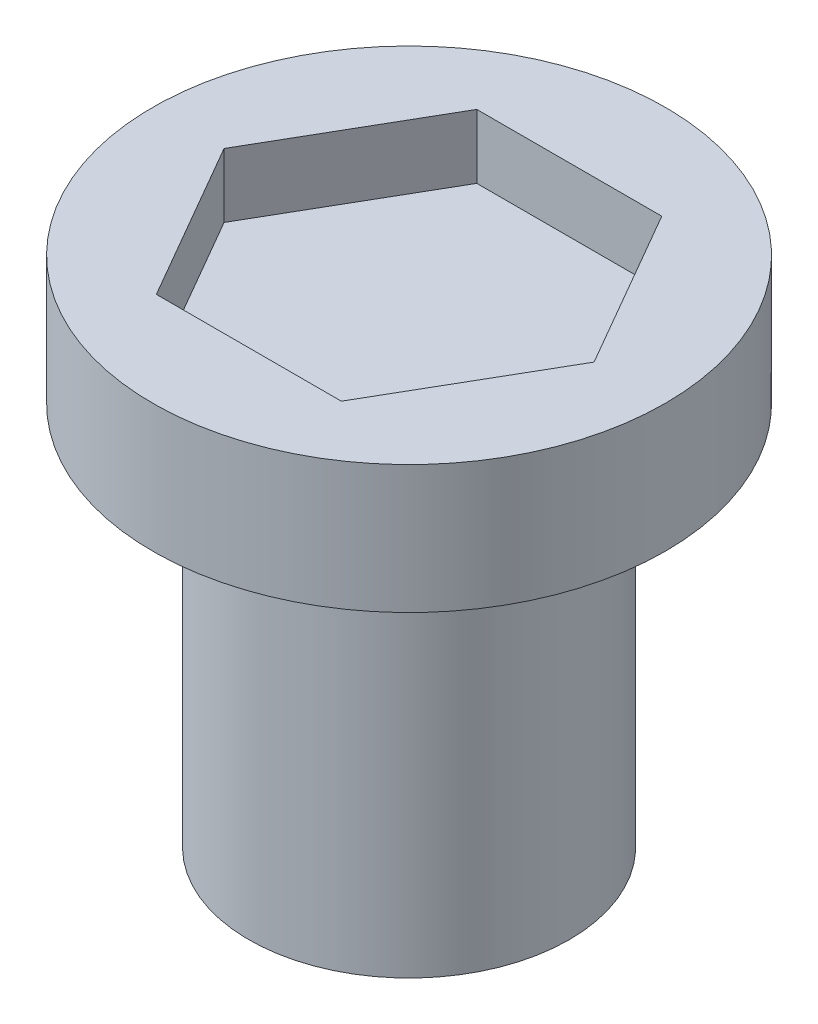
ISO-10303-21;
HEADER;
FILE_DESCRIPTION(('STEP AP214'),'2;1');
FILE_NAME('part.step','',(''),(''),'','','');
FILE_SCHEMA(('AUTOMOTIVE_DESIGN { 1 0 10303 214 1 1 1 1 }'));
ENDSEC;
DATA;
#1=APPLICATION_CONTEXT('core data for automotive mechanical design processes');
#2=APPLICATION_PROTOCOL_DEFINITION('international standard','automotive_design',2000,#1);
#3=PRODUCT_CONTEXT('',#1,'mechanical');
#4=PRODUCT('Part','Part','',(#3));
#5=PRODUCT_RELATED_PRODUCT_CATEGORY('part','',(#4));
#6=PRODUCT_DEFINITION_FORMATION('','',#4);
#7=PRODUCT_DEFINITION_CONTEXT('part definition',#1,'design');
#8=PRODUCT_DEFINITION('design','',#6,#7);
#9=PRODUCT_DEFINITION_SHAPE('','',#8);
#10=(LENGTH_UNIT() NAMED_UNIT(*) SI_UNIT(.MILLI.,.METRE.));
#11=(NAMED_UNIT(*) PLANE_ANGLE_UNIT() SI_UNIT($,.RADIAN.));
#12=(NAMED_UNIT(*) SI_UNIT($,.STERADIAN.) SOLID_ANGLE_UNIT());
#13=UNCERTAINTY_MEASURE_WITH_UNIT(LENGTH_MEASURE(1.E-05),#10,'distance_accuracy_value','');
#14=(GEOMETRIC_REPRESENTATION_CONTEXT(3) GLOBAL_UNCERTAINTY_ASSIGNED_CONTEXT((#13)) GLOBAL_UNIT_ASSIGNED_CONTEXT((#10,
#11,#12)) REPRESENTATION_CONTEXT('',''));
#15=CARTESIAN_POINT('',(0.,0.,0.));
#16=DIRECTION('',(0.,0.,1.));
#17=DIRECTION('',(1.,0.,0.));
#18=AXIS2_PLACEMENT_3D('',#15,#16,#17);
#19=CARTESIAN_POINT('',(0.,0.,0.));
#20=DIRECTION('',(0.,-1.,0.));
#21=DIRECTION('',(1.,0.,0.));
#22=AXIS2_PLACEMENT_3D('',#19,#20,#21);
#23=PLANE('',#22);
#24=CARTESIAN_POINT('',(0.,0.,0.));
#25=DIRECTION('',(0.,-1.,0.));
#26=DIRECTION('',(1.,0.,0.));
#27=AXIS2_PLACEMENT_3D('',#24,#25,#26);
#28=CIRCLE('',#27,1.25);
#29=CARTESIAN_POINT('',(1.25,0.,0.));
#30=VERTEX_POINT('',#29);
#31=EDGE_CURVE('E11',#30,#30,#28,.T.);
#32=ORIENTED_EDGE('',*,*,#31,.T.);
#33=EDGE_LOOP('',(#32));
#34=FACE_BOUND('',#33,.T.);
#35=ADVANCED_FACE('F43',(#34),#23,.T.);
#36=CARTESIAN_POINT('',(0.,4.,0.));
#37=DIRECTION('',(0.,-1.,0.));
#38=DIRECTION('',(1.,0.,0.));
#39=AXIS2_PLACEMENT_3D('',#36,#37,#38);
#40=CYLINDRICAL_SURFACE('',#39,1.25);
#41=CARTESIAN_POINT('',(0.,3.,0.));
#42=DIRECTION('',(0.,-1.,0.));
#43=DIRECTION('',(1.,0.,0.));
#44=AXIS2_PLACEMENT_3D('',#41,#42,#43);
#45=CIRCLE('',#44,1.25);
#46=CARTESIAN_POINT('',(1.25,3.,0.));
#47=VERTEX_POINT('',#46);
#48=EDGE_CURVE('E51',#47,#47,#45,.T.);
#49=ORIENTED_EDGE('',*,*,#48,.T.);
#50=EDGE_LOOP('',(#49));
#51=FACE_BOUND('',#50,.T.);
#52=ORIENTED_EDGE('',*,*,#31,.F.);
#53=EDGE_LOOP('',(#52));
#54=FACE_BOUND('',#53,.T.);
#55=ADVANCED_FACE('F177',(#51,#54),#40,.T.);
#56=CARTESIAN_POINT('',(1.25,3.,0.));
#57=DIRECTION('',(0.,-1.,0.));
#58=DIRECTION('',(1.,0.,0.));
#59=AXIS2_PLACEMENT_3D('',#56,#57,#58);
#60=PLANE('',#59);
#61=CARTESIAN_POINT('',(0.,3.,0.));
#62=DIRECTION('',(0.,-1.,0.));
#63=DIRECTION('',(1.,0.,0.));
#64=AXIS2_PLACEMENT_3D('',#61,#62,#63);
#65=CIRCLE('',#64,2.);
#66=CARTESIAN_POINT('',(2.,3.,0.));
#67=VERTEX_POINT('',#66);
#68=EDGE_CURVE('E170',#67,#67,#65,.T.);
#69=ORIENTED_EDGE('',*,*,#68,.T.);
#70=EDGE_LOOP('',(#69));
#71=FACE_BOUND('',#70,.T.);
#72=ORIENTED_EDGE('',*,*,#48,.F.);
#73=EDGE_LOOP('',(#72));
#74=FACE_BOUND('',#73,.T.);
#75=ADVANCED_FACE('F180',(#71,#74),#60,.T.);
#76=CARTESIAN_POINT('',(0.,4.,0.));
#77=DIRECTION('',(0.,-1.,0.));
#78=DIRECTION('',(1.,0.,0.));
#79=AXIS2_PLACEMENT_3D('',#76,#77,#78);
#80=CYLINDRICAL_SURFACE('',#79,2.);
#81=CARTESIAN_POINT('',(0.,4.,0.));
#82=DIRECTION('',(0.,-1.,0.));
#83=DIRECTION('',(1.,0.,0.));
#84=AXIS2_PLACEMENT_3D('',#81,#82,#83);
#85=CIRCLE('',#84,2.);
#86=CARTESIAN_POINT('',(2.,4.,0.));
#87=VERTEX_POINT('',#86);
#88=EDGE_CURVE('E157',#87,#87,#85,.T.);
#89=ORIENTED_EDGE('',*,*,#88,.T.);
#90=EDGE_LOOP('',(#89));
#91=FACE_BOUND('',#90,.T.);
#92=ORIENTED_EDGE('',*,*,#68,.F.);
#93=EDGE_LOOP('',(#92));
#94=FACE_BOUND('',#93,.T.);
#95=ADVANCED_FACE('F182',(#91,#94),#80,.T.);
#96=CARTESIAN_POINT('',(2.,4.,0.));
#97=DIRECTION('',(0.,1.,0.));
#98=DIRECTION('',(-1.,0.,0.));
#99=AXIS2_PLACEMENT_3D('',#96,#97,#98);
#100=PLANE('',#99);
#101=DIRECTION('',(0.5,0.,-0.866025403784439));
#102=VECTOR('',#101,1.);
#103=CARTESIAN_POINT('',(0.721687836487032,4.,1.25));
#104=LINE('',#103,#102);
#105=CARTESIAN_POINT('',(0.721687836487032,4.,1.25));
#106=VERTEX_POINT('',#105);
#107=CARTESIAN_POINT('',(1.44337567297406,4.,0.));
#108=VERTEX_POINT('',#107);
#109=EDGE_CURVE('E58',#106,#108,#104,.T.);
#110=ORIENTED_EDGE('',*,*,#109,.F.);
#111=DIRECTION('',(1.,0.,0.));
#112=VECTOR('',#111,1.);
#113=CARTESIAN_POINT('',(-0.721687836487033,4.,1.25));
#114=LINE('',#113,#112);
#115=CARTESIAN_POINT('',(-0.721687836487033,4.,1.25));
#116=VERTEX_POINT('',#115);
#117=EDGE_CURVE('E151',#116,#106,#114,.T.);
#118=ORIENTED_EDGE('',*,*,#117,.F.);
#119=DIRECTION('',(0.5,0.,0.866025403784438));
#120=VECTOR('',#119,1.);
#121=CARTESIAN_POINT('',(-1.44337567297407,4.,0.));
#122=LINE('',#121,#120);
#123=CARTESIAN_POINT('',(-1.44337567297407,4.,0.));
#124=VERTEX_POINT('',#123);
#125=EDGE_CURVE('E148',#124,#116,#122,.T.);
#126=ORIENTED_EDGE('',*,*,#125,.F.);
#127=DIRECTION('',(-0.5,0.,0.866025403784439));
#128=VECTOR('',#127,1.);
#129=CARTESIAN_POINT('',(-0.721687836487033,4.,-1.25));
#130=LINE('',#129,#128);
#131=CARTESIAN_POINT('',(-0.721687836487033,4.,-1.25));
#132=VERTEX_POINT('',#131);
#133=EDGE_CURVE('E106',#132,#124,#130,.T.);
#134=ORIENTED_EDGE('',*,*,#133,.F.);
#135=DIRECTION('',(-1.,0.,0.));
#136=VECTOR('',#135,1.);
#137=CARTESIAN_POINT('',(0.721687836487031,4.,-1.25));
#138=LINE('',#137,#136);
#139=CARTESIAN_POINT('',(0.721687836487031,4.,-1.25));
#140=VERTEX_POINT('',#139);
#141=EDGE_CURVE('E142',#140,#132,#138,.T.);
#142=ORIENTED_EDGE('',*,*,#141,.F.);
#143=DIRECTION('',(-0.5,0.,-0.866025403784438));
#144=VECTOR('',#143,1.);
#145=CARTESIAN_POINT('',(1.44337567297406,4.,0.));
#146=LINE('',#145,#144);
#147=EDGE_CURVE('E138',#108,#140,#146,.T.);
#148=ORIENTED_EDGE('',*,*,#147,.F.);
#149=EDGE_LOOP('',(#110,#118,#126,#134,#142,#148));
#150=FACE_BOUND('',#149,.T.);
#151=ORIENTED_EDGE('',*,*,#88,.F.);
#152=EDGE_LOOP('',(#151));
#153=FACE_BOUND('',#152,.T.);
#154=ADVANCED_FACE('F189',(#150,#153),#100,.T.);
#155=CARTESIAN_POINT('',(0.721687836487032,3.5,1.25));
#156=DIRECTION('',(0.866025403784439,0.,0.5));
#157=DIRECTION('',(0.5,0.,-0.866025403784439));
#158=AXIS2_PLACEMENT_3D('',#155,#156,#157);
#159=PLANE('',#158);
#160=ORIENTED_EDGE('',*,*,#109,.T.);
#161=DIRECTION('',(0.,1.,0.));
#162=VECTOR('',#161,1.);
#163=CARTESIAN_POINT('',(1.44337567297406,3.5,0.));
#164=LINE('',#163,#162);
#165=CARTESIAN_POINT('',(1.44337567297406,3.5,0.));
#166=VERTEX_POINT('',#165);
#167=EDGE_CURVE('E88',#166,#108,#164,.T.);
#168=ORIENTED_EDGE('',*,*,#167,.F.);
#169=DIRECTION('',(0.5,0.,-0.866025403784439));
#170=VECTOR('',#169,1.);
#171=CARTESIAN_POINT('',(0.721687836487032,3.5,1.25));
#172=LINE('',#171,#170);
#173=CARTESIAN_POINT('',(0.721687836487032,3.5,1.25));
#174=VERTEX_POINT('',#173);
#175=EDGE_CURVE('E154',#174,#166,#172,.T.);
#176=ORIENTED_EDGE('',*,*,#175,.F.);
#177=DIRECTION('',(0.,1.,0.));
#178=VECTOR('',#177,1.);
#179=CARTESIAN_POINT('',(0.721687836487032,3.5,1.25));
#180=LINE('',#179,#178);
#181=EDGE_CURVE('E66',#174,#106,#180,.T.);
#182=ORIENTED_EDGE('',*,*,#181,.T.);
#183=EDGE_LOOP('',(#160,#168,#176,#182));
#184=FACE_BOUND('',#183,.T.);
#185=ADVANCED_FACE('F223',(#184),#159,.F.);
#186=CARTESIAN_POINT('',(-0.721687836487033,3.5,1.25));
#187=DIRECTION('',(0.,0.,1.));
#188=DIRECTION('',(1.,0.,0.));
#189=AXIS2_PLACEMENT_3D('',#186,#187,#188);
#190=PLANE('',#189);
#191=ORIENTED_EDGE('',*,*,#117,.T.);
#192=ORIENTED_EDGE('',*,*,#181,.F.);
#193=DIRECTION('',(1.,0.,0.));
#194=VECTOR('',#193,1.);
#195=CARTESIAN_POINT('',(-0.721687836487033,3.5,1.25));
#196=LINE('',#195,#194);
#197=CARTESIAN_POINT('',(-0.721687836487033,3.5,1.25));
#198=VERTEX_POINT('',#197);
#199=EDGE_CURVE('E120',#198,#174,#196,.T.);
#200=ORIENTED_EDGE('',*,*,#199,.F.);
#201=DIRECTION('',(0.,1.,0.));
#202=VECTOR('',#201,1.);
#203=CARTESIAN_POINT('',(-0.721687836487033,3.5,1.25));
#204=LINE('',#203,#202);
#205=EDGE_CURVE('E111',#198,#116,#204,.T.);
#206=ORIENTED_EDGE('',*,*,#205,.T.);
#207=EDGE_LOOP('',(#191,#192,#200,#206));
#208=FACE_BOUND('',#207,.T.);
#209=ADVANCED_FACE('F234',(#208),#190,.F.);
#210=CARTESIAN_POINT('',(-1.44337567297407,3.5,0.));
#211=DIRECTION('',(-0.866025403784438,0.,0.5));
#212=DIRECTION('',(0.5,0.,0.866025403784438));
#213=AXIS2_PLACEMENT_3D('',#210,#211,#212);
#214=PLANE('',#213);
#215=ORIENTED_EDGE('',*,*,#125,.T.);
#216=ORIENTED_EDGE('',*,*,#205,.F.);
#217=DIRECTION('',(0.5,0.,0.866025403784438));
#218=VECTOR('',#217,1.);
#219=CARTESIAN_POINT('',(-1.44337567297407,3.5,0.));
#220=LINE('',#219,#218);
#221=CARTESIAN_POINT('',(-1.44337567297407,3.5,0.));
#222=VERTEX_POINT('',#221);
#223=EDGE_CURVE('E115',#222,#198,#220,.T.);
#224=ORIENTED_EDGE('',*,*,#223,.F.);
#225=DIRECTION('',(0.,1.,0.));
#226=VECTOR('',#225,1.);
#227=CARTESIAN_POINT('',(-1.44337567297407,3.5,0.));
#228=LINE('',#227,#226);
#229=EDGE_CURVE('E99',#222,#124,#228,.T.);
#230=ORIENTED_EDGE('',*,*,#229,.T.);
#231=EDGE_LOOP('',(#215,#216,#224,#230));
#232=FACE_BOUND('',#231,.T.);
#233=ADVANCED_FACE('F116',(#232),#214,.F.);
#234=CARTESIAN_POINT('',(-0.721687836487033,3.5,-1.25));
#235=DIRECTION('',(-0.866025403784439,0.,-0.5));
#236=DIRECTION('',(-0.5,0.,0.866025403784439));
#237=AXIS2_PLACEMENT_3D('',#234,#235,#236);
#238=PLANE('',#237);
#239=ORIENTED_EDGE('',*,*,#133,.T.);
#240=ORIENTED_EDGE('',*,*,#229,.F.);
#241=DIRECTION('',(-0.5,0.,0.866025403784439));
#242=VECTOR('',#241,1.);
#243=CARTESIAN_POINT('',(-0.721687836487033,3.5,-1.25));
#244=LINE('',#243,#242);
#245=CARTESIAN_POINT('',(-0.721687836487033,3.5,-1.25));
#246=VERTEX_POINT('',#245);
#247=EDGE_CURVE('E103',#246,#222,#244,.T.);
#248=ORIENTED_EDGE('',*,*,#247,.F.);
#249=DIRECTION('',(0.,1.,0.));
#250=VECTOR('',#249,1.);
#251=CARTESIAN_POINT('',(-0.721687836487033,3.5,-1.25));
#252=LINE('',#251,#250);
#253=EDGE_CURVE('E112',#246,#132,#252,.T.);
#254=ORIENTED_EDGE('',*,*,#253,.T.);
#255=EDGE_LOOP('',(#239,#240,#248,#254));
#256=FACE_BOUND('',#255,.T.);
#257=ADVANCED_FACE('F101',(#256),#238,.F.);
#258=CARTESIAN_POINT('',(0.721687836487031,3.5,-1.25));
#259=DIRECTION('',(0.,0.,-1.));
#260=DIRECTION('',(-1.,0.,0.));
#261=AXIS2_PLACEMENT_3D('',#258,#259,#260);
#262=PLANE('',#261);
#263=ORIENTED_EDGE('',*,*,#141,.T.);
#264=ORIENTED_EDGE('',*,*,#253,.F.);
#265=DIRECTION('',(-1.,0.,0.));
#266=VECTOR('',#265,1.);
#267=CARTESIAN_POINT('',(0.721687836487031,3.5,-1.25));
#268=LINE('',#267,#266);
#269=CARTESIAN_POINT('',(0.721687836487031,3.5,-1.25));
#270=VERTEX_POINT('',#269);
#271=EDGE_CURVE('E126',#270,#246,#268,.T.);
#272=ORIENTED_EDGE('',*,*,#271,.F.);
#273=DIRECTION('',(0.,1.,0.));
#274=VECTOR('',#273,1.);
#275=CARTESIAN_POINT('',(0.721687836487031,3.5,-1.25));
#276=LINE('',#275,#274);
#277=EDGE_CURVE('E162',#270,#140,#276,.T.);
#278=ORIENTED_EDGE('',*,*,#277,.T.);
#279=EDGE_LOOP('',(#263,#264,#272,#278));
#280=FACE_BOUND('',#279,.T.);
#281=ADVANCED_FACE('F262',(#280),#262,.F.);
#282=CARTESIAN_POINT('',(1.44337567297406,3.5,0.));
#283=DIRECTION('',(0.866025403784439,0.,-0.5));
#284=DIRECTION('',(-0.5,0.,-0.866025403784439));
#285=AXIS2_PLACEMENT_3D('',#282,#283,#284);
#286=PLANE('',#285);
#287=ORIENTED_EDGE('',*,*,#147,.T.);
#288=ORIENTED_EDGE('',*,*,#277,.F.);
#289=DIRECTION('',(-0.5,0.,-0.866025403784438));
#290=VECTOR('',#289,1.);
#291=CARTESIAN_POINT('',(1.44337567297406,3.5,0.));
#292=LINE('',#291,#290);
#293=EDGE_CURVE('E130',#166,#270,#292,.T.);
#294=ORIENTED_EDGE('',*,*,#293,.F.);
#295=ORIENTED_EDGE('',*,*,#167,.T.);
#296=EDGE_LOOP('',(#287,#288,#294,#295));
#297=FACE_BOUND('',#296,.T.);
#298=ADVANCED_FACE('F272',(#297),#286,.F.);
#299=CARTESIAN_POINT('',(0.,3.5,0.));
#300=DIRECTION('',(0.,1.,0.));
#301=DIRECTION('',(0.,0.,1.));
#302=AXIS2_PLACEMENT_3D('',#299,#300,#301);
#303=PLANE('',#302);
#304=ORIENTED_EDGE('',*,*,#175,.T.);
#305=ORIENTED_EDGE('',*,*,#293,.T.);
#306=ORIENTED_EDGE('',*,*,#271,.T.);
#307=ORIENTED_EDGE('',*,*,#247,.T.);
#308=ORIENTED_EDGE('',*,*,#223,.T.);
#309=ORIENTED_EDGE('',*,*,#199,.T.);
#310=EDGE_LOOP('',(#304,#305,#306,#307,#308,#309));
#311=FACE_BOUND('',#310,.T.);
#312=ADVANCED_FACE('F123',(#311),#303,.T.);
#313=CLOSED_SHELL('',(#35,#55,#75,#95,#154,#185,#209,#233,#257,#281,#298,#312));
#314=MANIFOLD_SOLID_BREP('B2',#313);
#315=ADVANCED_BREP_SHAPE_REPRESENTATION('',(#18,#314),#14);
#316=SHAPE_DEFINITION_REPRESENTATION(#9,#315);
ENDSEC;
END-ISO-10303-21;
